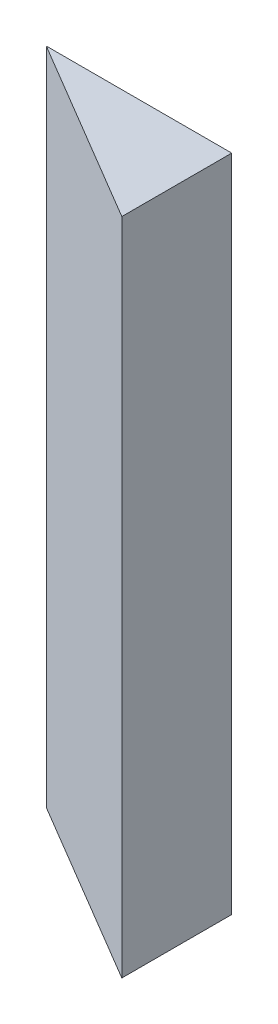
ISO-10303-21;
HEADER;
FILE_DESCRIPTION(('STEP AP214'),'2;1');
FILE_NAME('part.step','',(''),(''),'','','');
FILE_SCHEMA(('AUTOMOTIVE_DESIGN { 1 0 10303 214 1 1 1 1 }'));
ENDSEC;
DATA;
#1=APPLICATION_CONTEXT('core data for automotive mechanical design processes');
#2=APPLICATION_PROTOCOL_DEFINITION('international standard','automotive_design',2000,#1);
#3=PRODUCT_CONTEXT('',#1,'mechanical');
#4=PRODUCT('Part','Part','',(#3));
#5=PRODUCT_RELATED_PRODUCT_CATEGORY('part','',(#4));
#6=PRODUCT_DEFINITION_FORMATION('','',#4);
#7=PRODUCT_DEFINITION_CONTEXT('part definition',#1,'design');
#8=PRODUCT_DEFINITION('design','',#6,#7);
#9=PRODUCT_DEFINITION_SHAPE('','',#8);
#10=(LENGTH_UNIT() NAMED_UNIT(*) SI_UNIT(.MILLI.,.METRE.));
#11=(NAMED_UNIT(*) PLANE_ANGLE_UNIT() SI_UNIT($,.RADIAN.));
#12=(NAMED_UNIT(*) SI_UNIT($,.STERADIAN.) SOLID_ANGLE_UNIT());
#13=UNCERTAINTY_MEASURE_WITH_UNIT(LENGTH_MEASURE(1.E-05),#10,'distance_accuracy_value','');
#14=(GEOMETRIC_REPRESENTATION_CONTEXT(3) GLOBAL_UNCERTAINTY_ASSIGNED_CONTEXT((#13)) GLOBAL_UNIT_ASSIGNED_CONTEXT((#10,
#11,#12)) REPRESENTATION_CONTEXT('',''));
#15=CARTESIAN_POINT('',(0.,0.,0.));
#16=DIRECTION('',(0.,0.,1.));
#17=DIRECTION('',(1.,0.,0.));
#18=AXIS2_PLACEMENT_3D('',#15,#16,#17);
#19=CARTESIAN_POINT('',(-28.575,50.8,0.));
#20=DIRECTION('',(0.,0.,1.));
#21=DIRECTION('',(1.,0.,0.));
#22=AXIS2_PLACEMENT_3D('',#19,#20,#21);
#23=PLANE('',#22);
#24=DIRECTION('',(-1.,0.,0.));
#25=VECTOR('',#24,1.);
#26=CARTESIAN_POINT('',(-28.575,-50.8,0.));
#27=LINE('',#26,#25);
#28=CARTESIAN_POINT('',(0.,-50.8,0.));
#29=VERTEX_POINT('',#28);
#30=CARTESIAN_POINT('',(-28.575,-50.8,0.));
#31=VERTEX_POINT('',#30);
#32=EDGE_CURVE('E83',#29,#31,#27,.T.);
#33=ORIENTED_EDGE('',*,*,#32,.T.);
#34=DIRECTION('',(0.,-1.,0.));
#35=VECTOR('',#34,1.);
#36=CARTESIAN_POINT('',(-28.575,50.8,0.));
#37=LINE('',#36,#35);
#38=CARTESIAN_POINT('',(-28.575,50.8,0.));
#39=VERTEX_POINT('',#38);
#40=EDGE_CURVE('E11',#39,#31,#37,.T.);
#41=ORIENTED_EDGE('',*,*,#40,.F.);
#42=DIRECTION('',(-1.,0.,0.));
#43=VECTOR('',#42,1.);
#44=CARTESIAN_POINT('',(-28.575,50.8,0.));
#45=LINE('',#44,#43);
#46=CARTESIAN_POINT('',(0.,50.8,0.));
#47=VERTEX_POINT('',#46);
#48=EDGE_CURVE('E76',#47,#39,#45,.T.);
#49=ORIENTED_EDGE('',*,*,#48,.F.);
#50=DIRECTION('',(0.,-1.,0.));
#51=VECTOR('',#50,1.);
#52=CARTESIAN_POINT('',(0.,50.8,0.));
#53=LINE('',#52,#51);
#54=EDGE_CURVE('E84',#47,#29,#53,.T.);
#55=ORIENTED_EDGE('',*,*,#54,.T.);
#56=EDGE_LOOP('',(#33,#41,#49,#55));
#57=FACE_BOUND('',#56,.T.);
#58=ADVANCED_FACE('F36',(#57),#23,.F.);
#59=CARTESIAN_POINT('',(0.,50.8,16.9333333333333));
#60=DIRECTION('',(0.509802390301733,0.,-0.860291533634174));
#61=DIRECTION('',(-0.860291533634174,0.,-0.509802390301733));
#62=AXIS2_PLACEMENT_3D('',#59,#60,#61);
#63=PLANE('',#62);
#64=DIRECTION('',(0.860291533634174,0.,0.509802390301733));
#65=VECTOR('',#64,1.);
#66=CARTESIAN_POINT('',(0.,-50.8,16.9333333333333));
#67=LINE('',#66,#65);
#68=CARTESIAN_POINT('',(0.,-50.8,16.9333333333333));
#69=VERTEX_POINT('',#68);
#70=EDGE_CURVE('E64',#31,#69,#67,.T.);
#71=ORIENTED_EDGE('',*,*,#70,.T.);
#72=DIRECTION('',(0.,-1.,0.));
#73=VECTOR('',#72,1.);
#74=CARTESIAN_POINT('',(0.,50.8,16.9333333333333));
#75=LINE('',#74,#73);
#76=CARTESIAN_POINT('',(0.,50.8,16.9333333333333));
#77=VERTEX_POINT('',#76);
#78=EDGE_CURVE('E44',#77,#69,#75,.T.);
#79=ORIENTED_EDGE('',*,*,#78,.F.);
#80=DIRECTION('',(0.860291533634174,0.,0.509802390301733));
#81=VECTOR('',#80,1.);
#82=CARTESIAN_POINT('',(0.,50.8,16.9333333333333));
#83=LINE('',#82,#81);
#84=EDGE_CURVE('E72',#39,#77,#83,.T.);
#85=ORIENTED_EDGE('',*,*,#84,.F.);
#86=ORIENTED_EDGE('',*,*,#40,.T.);
#87=EDGE_LOOP('',(#71,#79,#85,#86));
#88=FACE_BOUND('',#87,.T.);
#89=ADVANCED_FACE('F73',(#88),#63,.F.);
#90=CARTESIAN_POINT('',(0.,50.8,0.));
#91=DIRECTION('',(-1.,0.,0.));
#92=DIRECTION('',(0.,0.,1.));
#93=AXIS2_PLACEMENT_3D('',#90,#91,#92);
#94=PLANE('',#93);
#95=DIRECTION('',(0.,0.,-1.));
#96=VECTOR('',#95,1.);
#97=CARTESIAN_POINT('',(0.,-50.8,0.));
#98=LINE('',#97,#96);
#99=EDGE_CURVE('E69',#69,#29,#98,.T.);
#100=ORIENTED_EDGE('',*,*,#99,.T.);
#101=ORIENTED_EDGE('',*,*,#54,.F.);
#102=DIRECTION('',(0.,0.,-1.));
#103=VECTOR('',#102,1.);
#104=CARTESIAN_POINT('',(0.,50.8,0.));
#105=LINE('',#104,#103);
#106=EDGE_CURVE('E52',#77,#47,#105,.T.);
#107=ORIENTED_EDGE('',*,*,#106,.F.);
#108=ORIENTED_EDGE('',*,*,#78,.T.);
#109=EDGE_LOOP('',(#100,#101,#107,#108));
#110=FACE_BOUND('',#109,.T.);
#111=ADVANCED_FACE('F91',(#110),#94,.F.);
#112=CARTESIAN_POINT('',(0.,50.8,0.));
#113=DIRECTION('',(0.,-1.,0.));
#114=DIRECTION('',(0.,0.,-1.));
#115=AXIS2_PLACEMENT_3D('',#112,#113,#114);
#116=PLANE('',#115);
#117=ORIENTED_EDGE('',*,*,#48,.T.);
#118=ORIENTED_EDGE('',*,*,#84,.T.);
#119=ORIENTED_EDGE('',*,*,#106,.T.);
#120=EDGE_LOOP('',(#117,#118,#119));
#121=FACE_BOUND('',#120,.T.);
#122=ADVANCED_FACE('F79',(#121),#116,.F.);
#123=CARTESIAN_POINT('',(0.,-50.8,0.));
#124=DIRECTION('',(0.,-1.,0.));
#125=DIRECTION('',(0.,0.,-1.));
#126=AXIS2_PLACEMENT_3D('',#123,#124,#125);
#127=PLANE('',#126);
#128=ORIENTED_EDGE('',*,*,#32,.F.);
#129=ORIENTED_EDGE('',*,*,#99,.F.);
#130=ORIENTED_EDGE('',*,*,#70,.F.);
#131=EDGE_LOOP('',(#128,#129,#130));
#132=FACE_BOUND('',#131,.T.);
#133=ADVANCED_FACE('F92',(#132),#127,.T.);
#134=CLOSED_SHELL('',(#58,#89,#111,#122,#133));
#135=MANIFOLD_SOLID_BREP('B2',#134);
#136=ADVANCED_BREP_SHAPE_REPRESENTATION('',(#18,#135),#14);
#137=SHAPE_DEFINITION_REPRESENTATION(#9,#136);
ENDSEC;
END-ISO-10303-21;
